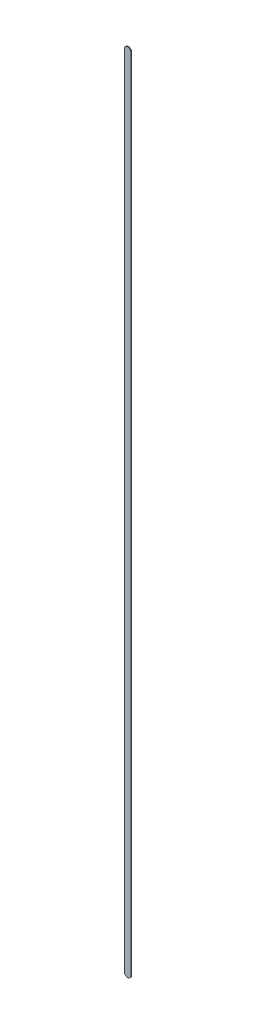
ISO-10303-21;
HEADER;
FILE_DESCRIPTION(('STEP AP214'),'2;1');
FILE_NAME('part.step','',(''),(''),'','','');
FILE_SCHEMA(('AUTOMOTIVE_DESIGN { 1 0 10303 214 1 1 1 1 }'));
ENDSEC;
DATA;
#1=APPLICATION_CONTEXT('core data for automotive mechanical design processes');
#2=APPLICATION_PROTOCOL_DEFINITION('international standard','automotive_design',2000,#1);
#3=PRODUCT_CONTEXT('',#1,'mechanical');
#4=PRODUCT('Part','Part','',(#3));
#5=PRODUCT_RELATED_PRODUCT_CATEGORY('part','',(#4));
#6=PRODUCT_DEFINITION_FORMATION('','',#4);
#7=PRODUCT_DEFINITION_CONTEXT('part definition',#1,'design');
#8=PRODUCT_DEFINITION('design','',#6,#7);
#9=PRODUCT_DEFINITION_SHAPE('','',#8);
#10=(LENGTH_UNIT() NAMED_UNIT(*) SI_UNIT(.MILLI.,.METRE.));
#11=(NAMED_UNIT(*) PLANE_ANGLE_UNIT() SI_UNIT($,.RADIAN.));
#12=(NAMED_UNIT(*) SI_UNIT($,.STERADIAN.) SOLID_ANGLE_UNIT());
#13=UNCERTAINTY_MEASURE_WITH_UNIT(LENGTH_MEASURE(1.E-05),#10,'distance_accuracy_value','');
#14=(GEOMETRIC_REPRESENTATION_CONTEXT(3) GLOBAL_UNCERTAINTY_ASSIGNED_CONTEXT((#13)) GLOBAL_UNIT_ASSIGNED_CONTEXT((#10,
#11,#12)) REPRESENTATION_CONTEXT('',''));
#15=CARTESIAN_POINT('',(0.,0.,0.));
#16=DIRECTION('',(0.,0.,1.));
#17=DIRECTION('',(1.,0.,0.));
#18=AXIS2_PLACEMENT_3D('',#15,#16,#17);
#19=CARTESIAN_POINT('',(39.587498779297,32.974998780831,1.1596000001));
#20=DIRECTION('',(0.,0.,1.));
#21=DIRECTION('',(1.,0.,0.));
#22=AXIS2_PLACEMENT_3D('',#19,#20,#21);
#23=PLANE('',#22);
#24=DIRECTION('',(0.,1.,0.));
#25=VECTOR('',#24,1.);
#26=CARTESIAN_POINT('',(39.523999023437,25.375,1.1596000001));
#27=LINE('',#26,#25);
#28=CARTESIAN_POINT('',(39.523999023437,25.374998779297,1.1596000001));
#29=VERTEX_POINT('',#28);
#30=CARTESIAN_POINT('',(39.523999023437,40.574999389648,1.1596000001));
#31=VERTEX_POINT('',#30);
#32=EDGE_CURVE('E72',#29,#31,#27,.T.);
#33=ORIENTED_EDGE('',*,*,#32,.T.);
#34=CARTESIAN_POINT('',(39.587498779297,40.574998779297,1.1596000001));
#35=DIRECTION('',(0.,0.,1.));
#36=DIRECTION('',(1.,0.,0.));
#37=AXIS2_PLACEMENT_3D('',#34,#35,#36);
#38=CIRCLE('',#37,0.06349975587111);
#39=CARTESIAN_POINT('',(39.650998535162,40.574998779297,1.1596000001));
#40=VERTEX_POINT('',#39);
#41=EDGE_CURVE('E65',#40,#31,#38,.T.);
#42=ORIENTED_EDGE('',*,*,#41,.F.);
#43=DIRECTION('',(0.,-1.,0.));
#44=VECTOR('',#43,1.);
#45=CARTESIAN_POINT('',(39.650998535156,40.575,1.1596000001));
#46=LINE('',#45,#44);
#47=CARTESIAN_POINT('',(39.650998535156,25.374999389648,1.1596000001));
#48=VERTEX_POINT('',#47);
#49=EDGE_CURVE('E21',#40,#48,#46,.T.);
#50=ORIENTED_EDGE('',*,*,#49,.T.);
#51=CARTESIAN_POINT('',(39.587498779297,25.374998779297,1.1596000001));
#52=DIRECTION('',(0.,0.,1.));
#53=DIRECTION('',(1.,0.,0.));
#54=AXIS2_PLACEMENT_3D('',#51,#52,#53);
#55=CIRCLE('',#54,0.06349975587111);
#56=EDGE_CURVE('E11',#29,#48,#55,.T.);
#57=ORIENTED_EDGE('',*,*,#56,.F.);
#58=EDGE_LOOP('',(#33,#42,#50,#57));
#59=FACE_BOUND('',#58,.T.);
#60=ADVANCED_FACE('F17',(#59),#23,.F.);
#61=CARTESIAN_POINT('',(39.587498779297,25.374998779297,1.1596000001));
#62=DIRECTION('',(0.,0.,1.));
#63=DIRECTION('',(1.,0.,0.));
#64=AXIS2_PLACEMENT_3D('',#61,#62,#63);
#65=CYLINDRICAL_SURFACE('',#64,0.06349975587111);
#66=DIRECTION('',(0.,0.,1.));
#67=VECTOR('',#66,1.);
#68=CARTESIAN_POINT('',(39.650998535156,25.375,1.1596000001));
#69=LINE('',#68,#67);
#70=CARTESIAN_POINT('',(39.650998535156,25.374999389648,1.1723000001));
#71=VERTEX_POINT('',#70);
#72=EDGE_CURVE('E95',#48,#71,#69,.T.);
#73=ORIENTED_EDGE('',*,*,#72,.T.);
#74=CARTESIAN_POINT('',(39.587498779297,25.374998779297,1.1723000001));
#75=DIRECTION('',(0.,0.,1.));
#76=DIRECTION('',(1.,0.,0.));
#77=AXIS2_PLACEMENT_3D('',#74,#75,#76);
#78=CIRCLE('',#77,0.06349975587111);
#79=CARTESIAN_POINT('',(39.523999023437,25.374998779297,1.1723000001));
#80=VERTEX_POINT('',#79);
#81=EDGE_CURVE('E79',#80,#71,#78,.T.);
#82=ORIENTED_EDGE('',*,*,#81,.F.);
#83=DIRECTION('',(0.,0.,-1.));
#84=VECTOR('',#83,1.);
#85=CARTESIAN_POINT('',(39.523999023437,25.374998779297,1.1596000001));
#86=LINE('',#85,#84);
#87=EDGE_CURVE('E76',#80,#29,#86,.T.);
#88=ORIENTED_EDGE('',*,*,#87,.T.);
#89=ORIENTED_EDGE('',*,*,#56,.T.);
#90=EDGE_LOOP('',(#73,#82,#88,#89));
#91=FACE_BOUND('',#90,.T.);
#92=ADVANCED_FACE('F77',(#91),#65,.T.);
#93=CARTESIAN_POINT('',(39.650998535156,40.575,1.1596000001));
#94=DIRECTION('',(-1.,0.,0.));
#95=DIRECTION('',(0.,0.,1.));
#96=AXIS2_PLACEMENT_3D('',#93,#94,#95);
#97=PLANE('',#96);
#98=ORIENTED_EDGE('',*,*,#72,.F.);
#99=ORIENTED_EDGE('',*,*,#49,.F.);
#100=DIRECTION('',(0.,0.,-1.));
#101=VECTOR('',#100,1.);
#102=CARTESIAN_POINT('',(39.650998535168,40.574998779297,1.1596000001));
#103=LINE('',#102,#101);
#104=CARTESIAN_POINT('',(39.650998535162,40.574998779297,1.1723000001));
#105=VERTEX_POINT('',#104);
#106=EDGE_CURVE('E97',#105,#40,#103,.T.);
#107=ORIENTED_EDGE('',*,*,#106,.F.);
#108=DIRECTION('',(0.,1.,0.));
#109=VECTOR('',#108,1.);
#110=CARTESIAN_POINT('',(39.650998535156,32.974998780831,1.1723000001));
#111=LINE('',#110,#109);
#112=EDGE_CURVE('E92',#71,#105,#111,.T.);
#113=ORIENTED_EDGE('',*,*,#112,.F.);
#114=EDGE_LOOP('',(#98,#99,#107,#113));
#115=FACE_BOUND('',#114,.T.);
#116=ADVANCED_FACE('F138',(#115),#97,.F.);
#117=CARTESIAN_POINT('',(39.587498779297,40.574998779297,1.1596000001));
#118=DIRECTION('',(0.,0.,1.));
#119=DIRECTION('',(1.,0.,0.));
#120=AXIS2_PLACEMENT_3D('',#117,#118,#119);
#121=CYLINDRICAL_SURFACE('',#120,0.06349975587111);
#122=ORIENTED_EDGE('',*,*,#41,.T.);
#123=DIRECTION('',(0.,0.,1.));
#124=VECTOR('',#123,1.);
#125=CARTESIAN_POINT('',(39.523999023437,40.575,1.1596000001));
#126=LINE('',#125,#124);
#127=CARTESIAN_POINT('',(39.523999023437,40.574999389648,1.1723000001));
#128=VERTEX_POINT('',#127);
#129=EDGE_CURVE('E86',#31,#128,#126,.T.);
#130=ORIENTED_EDGE('',*,*,#129,.T.);
#131=CARTESIAN_POINT('',(39.587498779297,40.574998779297,1.1723000001));
#132=DIRECTION('',(0.,0.,1.));
#133=DIRECTION('',(1.,0.,0.));
#134=AXIS2_PLACEMENT_3D('',#131,#132,#133);
#135=CIRCLE('',#134,0.06349975587111);
#136=EDGE_CURVE('E99',#105,#128,#135,.T.);
#137=ORIENTED_EDGE('',*,*,#136,.F.);
#138=ORIENTED_EDGE('',*,*,#106,.T.);
#139=EDGE_LOOP('',(#122,#130,#137,#138));
#140=FACE_BOUND('',#139,.T.);
#141=ADVANCED_FACE('F19',(#140),#121,.T.);
#142=CARTESIAN_POINT('',(39.523999023437,25.375,1.1596000001));
#143=DIRECTION('',(1.,0.,0.));
#144=DIRECTION('',(0.,1.,0.));
#145=AXIS2_PLACEMENT_3D('',#142,#143,#144);
#146=PLANE('',#145);
#147=ORIENTED_EDGE('',*,*,#129,.F.);
#148=ORIENTED_EDGE('',*,*,#32,.F.);
#149=ORIENTED_EDGE('',*,*,#87,.F.);
#150=DIRECTION('',(0.,-1.,0.));
#151=VECTOR('',#150,1.);
#152=CARTESIAN_POINT('',(39.523999023437,32.974998780831,1.1723000001));
#153=LINE('',#152,#151);
#154=EDGE_CURVE('E103',#128,#80,#153,.T.);
#155=ORIENTED_EDGE('',*,*,#154,.F.);
#156=EDGE_LOOP('',(#147,#148,#149,#155));
#157=FACE_BOUND('',#156,.T.);
#158=ADVANCED_FACE('F85',(#157),#146,.F.);
#159=CARTESIAN_POINT('',(39.587498779297,32.974998780831,1.1723000001));
#160=DIRECTION('',(0.,0.,1.));
#161=DIRECTION('',(1.,0.,0.));
#162=AXIS2_PLACEMENT_3D('',#159,#160,#161);
#163=PLANE('',#162);
#164=ORIENTED_EDGE('',*,*,#136,.T.);
#165=ORIENTED_EDGE('',*,*,#154,.T.);
#166=ORIENTED_EDGE('',*,*,#81,.T.);
#167=ORIENTED_EDGE('',*,*,#112,.T.);
#168=EDGE_LOOP('',(#164,#165,#166,#167));
#169=FACE_BOUND('',#168,.T.);
#170=ADVANCED_FACE('F153',(#169),#163,.T.);
#171=CLOSED_SHELL('',(#60,#92,#116,#141,#158,#170));
#172=MANIFOLD_SOLID_BREP('B1',#171);
#173=ADVANCED_BREP_SHAPE_REPRESENTATION('',(#18,#172),#14);
#174=SHAPE_DEFINITION_REPRESENTATION(#9,#173);
ENDSEC;
END-ISO-10303-21;
